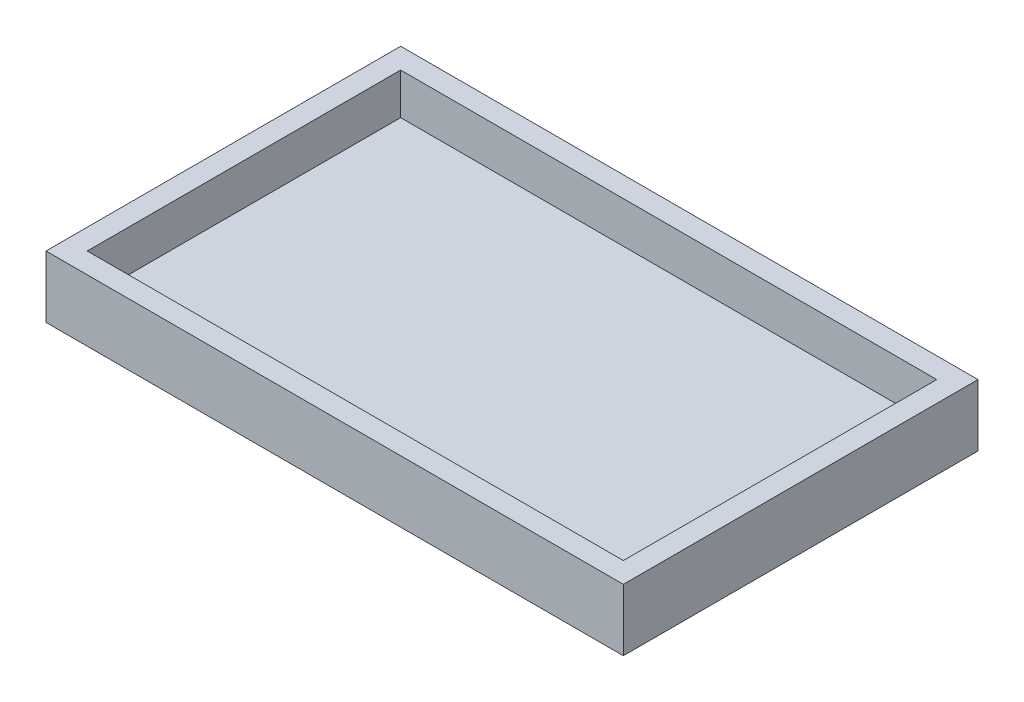
ISO-10303-21;
HEADER;
FILE_DESCRIPTION(('STEP AP214'),'2;1');
FILE_NAME('part.step','',(''),(''),'','','');
FILE_SCHEMA(('AUTOMOTIVE_DESIGN { 1 0 10303 214 1 1 1 1 }'));
ENDSEC;
DATA;
#1=APPLICATION_CONTEXT('core data for automotive mechanical design processes');
#2=APPLICATION_PROTOCOL_DEFINITION('international standard','automotive_design',2000,#1);
#3=PRODUCT_CONTEXT('',#1,'mechanical');
#4=PRODUCT('Part','Part','',(#3));
#5=PRODUCT_RELATED_PRODUCT_CATEGORY('part','',(#4));
#6=PRODUCT_DEFINITION_FORMATION('','',#4);
#7=PRODUCT_DEFINITION_CONTEXT('part definition',#1,'design');
#8=PRODUCT_DEFINITION('design','',#6,#7);
#9=PRODUCT_DEFINITION_SHAPE('','',#8);
#10=(LENGTH_UNIT() NAMED_UNIT(*) SI_UNIT(.MILLI.,.METRE.));
#11=(NAMED_UNIT(*) PLANE_ANGLE_UNIT() SI_UNIT($,.RADIAN.));
#12=(NAMED_UNIT(*) SI_UNIT($,.STERADIAN.) SOLID_ANGLE_UNIT());
#13=UNCERTAINTY_MEASURE_WITH_UNIT(LENGTH_MEASURE(1.E-05),#10,'distance_accuracy_value','');
#14=(GEOMETRIC_REPRESENTATION_CONTEXT(3) GLOBAL_UNCERTAINTY_ASSIGNED_CONTEXT((#13)) GLOBAL_UNIT_ASSIGNED_CONTEXT((#10,
#11,#12)) REPRESENTATION_CONTEXT('',''));
#15=CARTESIAN_POINT('',(0.,0.,0.));
#16=DIRECTION('',(0.,0.,1.));
#17=DIRECTION('',(1.,0.,0.));
#18=AXIS2_PLACEMENT_3D('',#15,#16,#17);
#19=CARTESIAN_POINT('',(33.02,7.62,19.304));
#20=DIRECTION('',(-1.,0.,0.));
#21=DIRECTION('',(0.,0.,1.));
#22=AXIS2_PLACEMENT_3D('',#19,#20,#21);
#23=PLANE('',#22);
#24=DIRECTION('',(0.,-1.,0.));
#25=VECTOR('',#24,1.);
#26=CARTESIAN_POINT('',(33.02,7.62,-19.304));
#27=LINE('',#26,#25);
#28=CARTESIAN_POINT('',(33.02,7.62,-19.304));
#29=VERTEX_POINT('',#28);
#30=CARTESIAN_POINT('',(33.02,2.54,-19.304));
#31=VERTEX_POINT('',#30);
#32=EDGE_CURVE('E124',#29,#31,#27,.T.);
#33=ORIENTED_EDGE('',*,*,#32,.T.);
#34=DIRECTION('',(0.,0.,-1.));
#35=VECTOR('',#34,1.);
#36=CARTESIAN_POINT('',(33.02,2.54,19.304));
#37=LINE('',#36,#35);
#38=CARTESIAN_POINT('',(33.02,2.54,19.304));
#39=VERTEX_POINT('',#38);
#40=EDGE_CURVE('E106',#39,#31,#37,.T.);
#41=ORIENTED_EDGE('',*,*,#40,.F.);
#42=DIRECTION('',(0.,-1.,0.));
#43=VECTOR('',#42,1.);
#44=CARTESIAN_POINT('',(33.02,7.62,19.304));
#45=LINE('',#44,#43);
#46=CARTESIAN_POINT('',(33.02,7.62,19.304));
#47=VERTEX_POINT('',#46);
#48=EDGE_CURVE('E130',#47,#39,#45,.T.);
#49=ORIENTED_EDGE('',*,*,#48,.F.);
#50=DIRECTION('',(0.,0.,-1.));
#51=VECTOR('',#50,1.);
#52=CARTESIAN_POINT('',(33.02,7.62,19.304));
#53=LINE('',#52,#51);
#54=EDGE_CURVE('E296',#47,#29,#53,.T.);
#55=ORIENTED_EDGE('',*,*,#54,.T.);
#56=EDGE_LOOP('',(#33,#41,#49,#55));
#57=FACE_BOUND('',#56,.T.);
#58=ADVANCED_FACE('F39',(#57),#23,.T.);
#59=CARTESIAN_POINT('',(-33.02,7.62,-19.304));
#60=DIRECTION('',(0.,0.,1.));
#61=DIRECTION('',(1.,0.,0.));
#62=AXIS2_PLACEMENT_3D('',#59,#60,#61);
#63=PLANE('',#62);
#64=DIRECTION('',(0.,-1.,0.));
#65=VECTOR('',#64,1.);
#66=CARTESIAN_POINT('',(-33.02,7.62,-19.304));
#67=LINE('',#66,#65);
#68=CARTESIAN_POINT('',(-33.02,7.62,-19.304));
#69=VERTEX_POINT('',#68);
#70=CARTESIAN_POINT('',(-33.02,2.54,-19.304));
#71=VERTEX_POINT('',#70);
#72=EDGE_CURVE('E116',#69,#71,#67,.T.);
#73=ORIENTED_EDGE('',*,*,#72,.T.);
#74=DIRECTION('',(1.,0.,0.));
#75=VECTOR('',#74,1.);
#76=CARTESIAN_POINT('',(-33.02,2.54,-19.304));
#77=LINE('',#76,#75);
#78=EDGE_CURVE('E103',#71,#31,#77,.T.);
#79=ORIENTED_EDGE('',*,*,#78,.T.);
#80=ORIENTED_EDGE('',*,*,#32,.F.);
#81=DIRECTION('',(-1.,0.,0.));
#82=VECTOR('',#81,1.);
#83=CARTESIAN_POINT('',(-33.02,7.62,-19.304));
#84=LINE('',#83,#82);
#85=EDGE_CURVE('E122',#29,#69,#84,.T.);
#86=ORIENTED_EDGE('',*,*,#85,.T.);
#87=EDGE_LOOP('',(#73,#79,#80,#86));
#88=FACE_BOUND('',#87,.T.);
#89=ADVANCED_FACE('F120',(#88),#63,.T.);
#90=CARTESIAN_POINT('',(-33.02,7.62,19.304));
#91=DIRECTION('',(1.,0.,0.));
#92=DIRECTION('',(0.,0.,-1.));
#93=AXIS2_PLACEMENT_3D('',#90,#91,#92);
#94=PLANE('',#93);
#95=DIRECTION('',(0.,-1.,0.));
#96=VECTOR('',#95,1.);
#97=CARTESIAN_POINT('',(-33.02,7.62,19.304));
#98=LINE('',#97,#96);
#99=CARTESIAN_POINT('',(-33.02,7.62,19.304));
#100=VERTEX_POINT('',#99);
#101=CARTESIAN_POINT('',(-33.02,2.54,19.304));
#102=VERTEX_POINT('',#101);
#103=EDGE_CURVE('E62',#100,#102,#98,.T.);
#104=ORIENTED_EDGE('',*,*,#103,.T.);
#105=DIRECTION('',(0.,0.,-1.));
#106=VECTOR('',#105,1.);
#107=CARTESIAN_POINT('',(-33.02,2.54,19.304));
#108=LINE('',#107,#106);
#109=EDGE_CURVE('E55',#102,#71,#108,.T.);
#110=ORIENTED_EDGE('',*,*,#109,.T.);
#111=ORIENTED_EDGE('',*,*,#72,.F.);
#112=DIRECTION('',(0.,0.,1.));
#113=VECTOR('',#112,1.);
#114=CARTESIAN_POINT('',(-33.02,7.62,19.304));
#115=LINE('',#114,#113);
#116=EDGE_CURVE('E289',#69,#100,#115,.T.);
#117=ORIENTED_EDGE('',*,*,#116,.T.);
#118=EDGE_LOOP('',(#104,#110,#111,#117));
#119=FACE_BOUND('',#118,.T.);
#120=ADVANCED_FACE('F115',(#119),#94,.T.);
#121=CARTESIAN_POINT('',(-33.02,7.62,19.304));
#122=DIRECTION('',(0.,0.,-1.));
#123=DIRECTION('',(-1.,0.,0.));
#124=AXIS2_PLACEMENT_3D('',#121,#122,#123);
#125=PLANE('',#124);
#126=ORIENTED_EDGE('',*,*,#48,.T.);
#127=DIRECTION('',(1.,0.,0.));
#128=VECTOR('',#127,1.);
#129=CARTESIAN_POINT('',(-33.02,2.54,19.304));
#130=LINE('',#129,#128);
#131=EDGE_CURVE('E283',#102,#39,#130,.T.);
#132=ORIENTED_EDGE('',*,*,#131,.F.);
#133=ORIENTED_EDGE('',*,*,#103,.F.);
#134=DIRECTION('',(1.,0.,0.));
#135=VECTOR('',#134,1.);
#136=CARTESIAN_POINT('',(-33.02,7.62,19.304));
#137=LINE('',#136,#135);
#138=EDGE_CURVE('E285',#100,#47,#137,.T.);
#139=ORIENTED_EDGE('',*,*,#138,.T.);
#140=EDGE_LOOP('',(#126,#132,#133,#139));
#141=FACE_BOUND('',#140,.T.);
#142=ADVANCED_FACE('F207',(#141),#125,.T.);
#143=CARTESIAN_POINT('',(0.,7.62,0.));
#144=DIRECTION('',(0.,1.,0.));
#145=DIRECTION('',(0.,0.,1.));
#146=AXIS2_PLACEMENT_3D('',#143,#144,#145);
#147=PLANE('',#146);
#148=DIRECTION('',(1.,0.,0.));
#149=VECTOR('',#148,1.);
#150=CARTESIAN_POINT('',(-35.56,7.62,21.844));
#151=LINE('',#150,#149);
#152=CARTESIAN_POINT('',(-35.56,7.62,21.844));
#153=VERTEX_POINT('',#152);
#154=CARTESIAN_POINT('',(35.56,7.62,21.844));
#155=VERTEX_POINT('',#154);
#156=EDGE_CURVE('E134',#153,#155,#151,.T.);
#157=ORIENTED_EDGE('',*,*,#156,.T.);
#158=DIRECTION('',(0.,0.,-1.));
#159=VECTOR('',#158,1.);
#160=CARTESIAN_POINT('',(35.56,7.62,21.844));
#161=LINE('',#160,#159);
#162=CARTESIAN_POINT('',(35.56,7.62,-21.844));
#163=VERTEX_POINT('',#162);
#164=EDGE_CURVE('E138',#155,#163,#161,.T.);
#165=ORIENTED_EDGE('',*,*,#164,.T.);
#166=DIRECTION('',(-1.,0.,0.));
#167=VECTOR('',#166,1.);
#168=CARTESIAN_POINT('',(-35.56,7.62,-21.844));
#169=LINE('',#168,#167);
#170=CARTESIAN_POINT('',(-35.56,7.62,-21.844));
#171=VERTEX_POINT('',#170);
#172=EDGE_CURVE('E142',#163,#171,#169,.T.);
#173=ORIENTED_EDGE('',*,*,#172,.T.);
#174=DIRECTION('',(0.,0.,1.));
#175=VECTOR('',#174,1.);
#176=CARTESIAN_POINT('',(-35.56,7.62,21.844));
#177=LINE('',#176,#175);
#178=EDGE_CURVE('E145',#171,#153,#177,.T.);
#179=ORIENTED_EDGE('',*,*,#178,.T.);
#180=EDGE_LOOP('',(#157,#165,#173,#179));
#181=FACE_BOUND('',#180,.T.);
#182=ORIENTED_EDGE('',*,*,#85,.F.);
#183=ORIENTED_EDGE('',*,*,#54,.F.);
#184=ORIENTED_EDGE('',*,*,#138,.F.);
#185=ORIENTED_EDGE('',*,*,#116,.F.);
#186=EDGE_LOOP('',(#182,#183,#184,#185));
#187=FACE_BOUND('',#186,.T.);
#188=ADVANCED_FACE('F187',(#181,#187),#147,.T.);
#189=CARTESIAN_POINT('',(0.,0.,0.));
#190=DIRECTION('',(0.,1.,0.));
#191=DIRECTION('',(0.,0.,1.));
#192=AXIS2_PLACEMENT_3D('',#189,#190,#191);
#193=PLANE('',#192);
#194=DIRECTION('',(1.,0.,0.));
#195=VECTOR('',#194,1.);
#196=CARTESIAN_POINT('',(-35.56,0.,21.844));
#197=LINE('',#196,#195);
#198=CARTESIAN_POINT('',(-35.56,0.,21.844));
#199=VERTEX_POINT('',#198);
#200=CARTESIAN_POINT('',(35.56,0.,21.844));
#201=VERTEX_POINT('',#200);
#202=EDGE_CURVE('E128',#199,#201,#197,.T.);
#203=ORIENTED_EDGE('',*,*,#202,.F.);
#204=DIRECTION('',(0.,0.,1.));
#205=VECTOR('',#204,1.);
#206=CARTESIAN_POINT('',(-35.56,0.,21.844));
#207=LINE('',#206,#205);
#208=CARTESIAN_POINT('',(-35.56,0.,-21.844));
#209=VERTEX_POINT('',#208);
#210=EDGE_CURVE('E139',#209,#199,#207,.T.);
#211=ORIENTED_EDGE('',*,*,#210,.F.);
#212=DIRECTION('',(-1.,0.,0.));
#213=VECTOR('',#212,1.);
#214=CARTESIAN_POINT('',(-35.56,0.,-21.844));
#215=LINE('',#214,#213);
#216=CARTESIAN_POINT('',(35.56,0.,-21.844));
#217=VERTEX_POINT('',#216);
#218=EDGE_CURVE('E155',#217,#209,#215,.T.);
#219=ORIENTED_EDGE('',*,*,#218,.F.);
#220=DIRECTION('',(0.,0.,-1.));
#221=VECTOR('',#220,1.);
#222=CARTESIAN_POINT('',(35.56,0.,21.844));
#223=LINE('',#222,#221);
#224=EDGE_CURVE('E152',#201,#217,#223,.T.);
#225=ORIENTED_EDGE('',*,*,#224,.F.);
#226=EDGE_LOOP('',(#203,#211,#219,#225));
#227=FACE_BOUND('',#226,.T.);
#228=ADVANCED_FACE('F178',(#227),#193,.F.);
#229=CARTESIAN_POINT('',(-35.56,7.62,21.844));
#230=DIRECTION('',(0.,0.,-1.));
#231=DIRECTION('',(-1.,0.,0.));
#232=AXIS2_PLACEMENT_3D('',#229,#230,#231);
#233=PLANE('',#232);
#234=ORIENTED_EDGE('',*,*,#202,.T.);
#235=DIRECTION('',(0.,-1.,0.));
#236=VECTOR('',#235,1.);
#237=CARTESIAN_POINT('',(35.56,7.62,21.844));
#238=LINE('',#237,#236);
#239=EDGE_CURVE('E11',#155,#201,#238,.T.);
#240=ORIENTED_EDGE('',*,*,#239,.F.);
#241=ORIENTED_EDGE('',*,*,#156,.F.);
#242=DIRECTION('',(0.,-1.,0.));
#243=VECTOR('',#242,1.);
#244=CARTESIAN_POINT('',(-35.56,7.62,21.844));
#245=LINE('',#244,#243);
#246=EDGE_CURVE('E148',#153,#199,#245,.T.);
#247=ORIENTED_EDGE('',*,*,#246,.T.);
#248=EDGE_LOOP('',(#234,#240,#241,#247));
#249=FACE_BOUND('',#248,.T.);
#250=ADVANCED_FACE('F41',(#249),#233,.F.);
#251=CARTESIAN_POINT('',(35.56,7.62,21.844));
#252=DIRECTION('',(-1.,0.,0.));
#253=DIRECTION('',(0.,0.,1.));
#254=AXIS2_PLACEMENT_3D('',#251,#252,#253);
#255=PLANE('',#254);
#256=ORIENTED_EDGE('',*,*,#224,.T.);
#257=DIRECTION('',(0.,-1.,0.));
#258=VECTOR('',#257,1.);
#259=CARTESIAN_POINT('',(35.56,7.62,-21.844));
#260=LINE('',#259,#258);
#261=EDGE_CURVE('E48',#163,#217,#260,.T.);
#262=ORIENTED_EDGE('',*,*,#261,.F.);
#263=ORIENTED_EDGE('',*,*,#164,.F.);
#264=ORIENTED_EDGE('',*,*,#239,.T.);
#265=EDGE_LOOP('',(#256,#262,#263,#264));
#266=FACE_BOUND('',#265,.T.);
#267=ADVANCED_FACE('F189',(#266),#255,.F.);
#268=CARTESIAN_POINT('',(-35.56,7.62,-21.844));
#269=DIRECTION('',(0.,0.,1.));
#270=DIRECTION('',(1.,0.,0.));
#271=AXIS2_PLACEMENT_3D('',#268,#269,#270);
#272=PLANE('',#271);
#273=ORIENTED_EDGE('',*,*,#218,.T.);
#274=DIRECTION('',(0.,-1.,0.));
#275=VECTOR('',#274,1.);
#276=CARTESIAN_POINT('',(-35.56,7.62,-21.844));
#277=LINE('',#276,#275);
#278=EDGE_CURVE('E163',#171,#209,#277,.T.);
#279=ORIENTED_EDGE('',*,*,#278,.F.);
#280=ORIENTED_EDGE('',*,*,#172,.F.);
#281=ORIENTED_EDGE('',*,*,#261,.T.);
#282=EDGE_LOOP('',(#273,#279,#280,#281));
#283=FACE_BOUND('',#282,.T.);
#284=ADVANCED_FACE('F172',(#283),#272,.F.);
#285=CARTESIAN_POINT('',(-35.56,7.62,21.844));
#286=DIRECTION('',(1.,0.,0.));
#287=DIRECTION('',(0.,0.,-1.));
#288=AXIS2_PLACEMENT_3D('',#285,#286,#287);
#289=PLANE('',#288);
#290=ORIENTED_EDGE('',*,*,#210,.T.);
#291=ORIENTED_EDGE('',*,*,#246,.F.);
#292=ORIENTED_EDGE('',*,*,#178,.F.);
#293=ORIENTED_EDGE('',*,*,#278,.T.);
#294=EDGE_LOOP('',(#290,#291,#292,#293));
#295=FACE_BOUND('',#294,.T.);
#296=ADVANCED_FACE('F181',(#295),#289,.F.);
#297=CARTESIAN_POINT('',(0.,2.54,0.));
#298=DIRECTION('',(0.,-1.,0.));
#299=DIRECTION('',(0.,0.,-1.));
#300=AXIS2_PLACEMENT_3D('',#297,#298,#299);
#301=PLANE('',#300);
#302=ORIENTED_EDGE('',*,*,#109,.F.);
#303=ORIENTED_EDGE('',*,*,#131,.T.);
#304=ORIENTED_EDGE('',*,*,#40,.T.);
#305=ORIENTED_EDGE('',*,*,#78,.F.);
#306=EDGE_LOOP('',(#302,#303,#304,#305));
#307=FACE_BOUND('',#306,.T.);
#308=ADVANCED_FACE('F104',(#307),#301,.F.);
#309=CLOSED_SHELL('',(#58,#89,#120,#142,#188,#228,#250,#267,#284,#296,#308));
#310=MANIFOLD_SOLID_BREP('B2',#309);
#311=ADVANCED_BREP_SHAPE_REPRESENTATION('',(#18,#310),#14);
#312=SHAPE_DEFINITION_REPRESENTATION(#9,#311);
ENDSEC;
END-ISO-10303-21;
